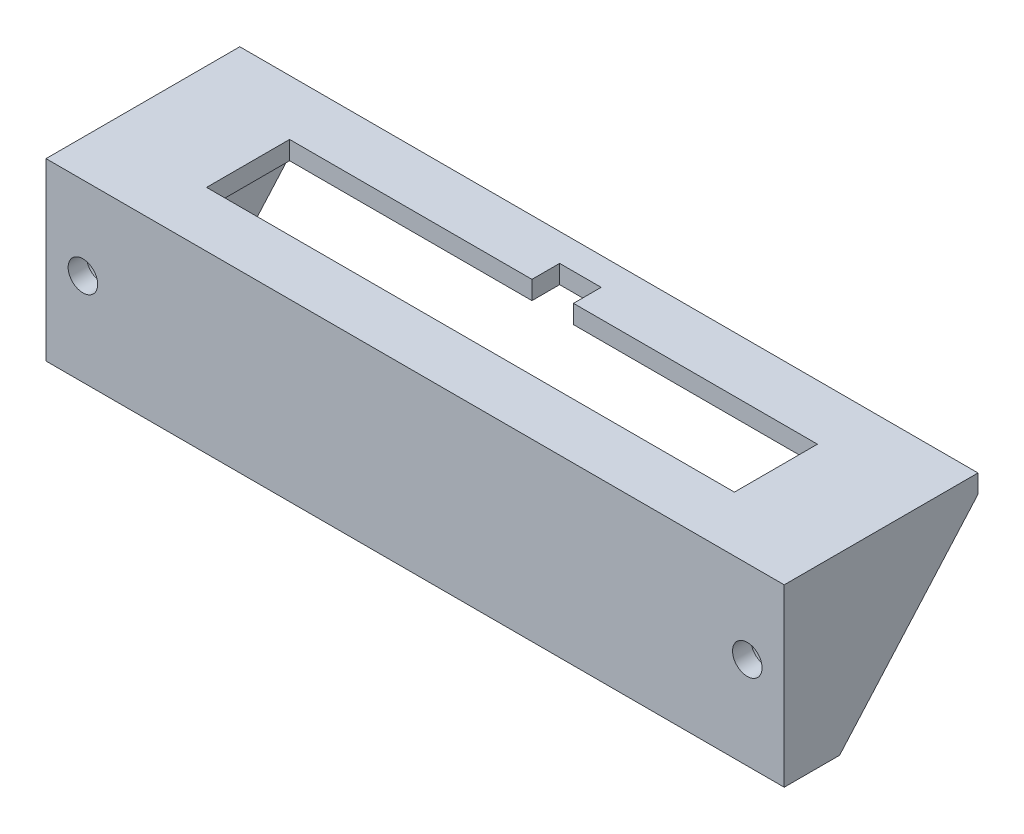
ISO-10303-21;
HEADER;
FILE_DESCRIPTION(('STEP AP214'),'2;1');
FILE_NAME('part.step','',(''),(''),'','','');
FILE_SCHEMA(('AUTOMOTIVE_DESIGN { 1 0 10303 214 1 1 1 1 }'));
ENDSEC;
DATA;
#1=APPLICATION_CONTEXT('core data for automotive mechanical design processes');
#2=APPLICATION_PROTOCOL_DEFINITION('international standard','automotive_design',2000,#1);
#3=PRODUCT_CONTEXT('',#1,'mechanical');
#4=PRODUCT('Part','Part','',(#3));
#5=PRODUCT_RELATED_PRODUCT_CATEGORY('part','',(#4));
#6=PRODUCT_DEFINITION_FORMATION('','',#4);
#7=PRODUCT_DEFINITION_CONTEXT('part definition',#1,'design');
#8=PRODUCT_DEFINITION('design','',#6,#7);
#9=PRODUCT_DEFINITION_SHAPE('','',#8);
#10=(LENGTH_UNIT() NAMED_UNIT(*) SI_UNIT(.MILLI.,.METRE.));
#11=(NAMED_UNIT(*) PLANE_ANGLE_UNIT() SI_UNIT($,.RADIAN.));
#12=(NAMED_UNIT(*) SI_UNIT($,.STERADIAN.) SOLID_ANGLE_UNIT());
#13=UNCERTAINTY_MEASURE_WITH_UNIT(LENGTH_MEASURE(1.E-05),#10,'distance_accuracy_value','');
#14=(GEOMETRIC_REPRESENTATION_CONTEXT(3) GLOBAL_UNCERTAINTY_ASSIGNED_CONTEXT((#13)) GLOBAL_UNIT_ASSIGNED_CONTEXT((#10,
#11,#12)) REPRESENTATION_CONTEXT('',''));
#15=CARTESIAN_POINT('',(0.,0.,0.));
#16=DIRECTION('',(0.,0.,1.));
#17=DIRECTION('',(1.,0.,0.));
#18=AXIS2_PLACEMENT_3D('',#15,#16,#17);
#19=CARTESIAN_POINT('',(0.,12.25,0.));
#20=DIRECTION('',(0.,1.,0.));
#21=DIRECTION('',(0.,0.,1.));
#22=AXIS2_PLACEMENT_3D('',#19,#20,#21);
#23=PLANE('',#22);
#24=DIRECTION('',(1.,0.,0.));
#25=VECTOR('',#24,1.);
#26=CARTESIAN_POINT('',(-26.4810638742548,12.25,28.0872942984967));
#27=LINE('',#26,#25);
#28=CARTESIAN_POINT('',(-26.4810638742548,12.25,28.0872942984967));
#29=VERTEX_POINT('',#28);
#30=CARTESIAN_POINT('',(-23.0810638742548,12.25,28.0872942984967));
#31=VERTEX_POINT('',#30);
#32=EDGE_CURVE('E187',#29,#31,#27,.T.);
#33=ORIENTED_EDGE('',*,*,#32,.F.);
#34=DIRECTION('',(0.,0.,1.));
#35=VECTOR('',#34,1.);
#36=CARTESIAN_POINT('',(-26.4810638742548,12.25,13.0872942984967));
#37=LINE('',#36,#35);
#38=CARTESIAN_POINT('',(-26.4810638742548,12.25,13.0872942984967));
#39=VERTEX_POINT('',#38);
#40=EDGE_CURVE('E234',#39,#29,#37,.T.);
#41=ORIENTED_EDGE('',*,*,#40,.F.);
#42=DIRECTION('',(-1.,0.,0.));
#43=VECTOR('',#42,1.);
#44=CARTESIAN_POINT('',(-34.4810638742549,12.25,13.0872942984967));
#45=LINE('',#44,#43);
#46=CARTESIAN_POINT('',(37.5189361257452,12.25,13.0872942984967));
#47=VERTEX_POINT('',#46);
#48=EDGE_CURVE('E85',#47,#39,#45,.T.);
#49=ORIENTED_EDGE('',*,*,#48,.F.);
#50=DIRECTION('',(0.,0.,1.));
#51=VECTOR('',#50,1.);
#52=CARTESIAN_POINT('',(37.5189361257452,12.25,13.0872942984967));
#53=LINE('',#52,#51);
#54=CARTESIAN_POINT('',(37.5189361257452,12.25,28.0872942984967));
#55=VERTEX_POINT('',#54);
#56=EDGE_CURVE('E191',#47,#55,#53,.T.);
#57=ORIENTED_EDGE('',*,*,#56,.T.);
#58=CARTESIAN_POINT('',(34.1189361257452,12.25,28.0872942984967));
#59=VERTEX_POINT('',#58);
#60=EDGE_CURVE('E175',#59,#55,#27,.T.);
#61=ORIENTED_EDGE('',*,*,#60,.F.);
#62=DIRECTION('',(0.,0.,-1.));
#63=VECTOR('',#62,1.);
#64=CARTESIAN_POINT('',(34.1189361257452,12.25,28.0872942984967));
#65=LINE('',#64,#63);
#66=CARTESIAN_POINT('',(34.1189361257452,12.25,19.0872942984967));
#67=VERTEX_POINT('',#66);
#68=EDGE_CURVE('E286',#59,#67,#65,.T.);
#69=ORIENTED_EDGE('',*,*,#68,.T.);
#70=DIRECTION('',(-1.,0.,0.));
#71=VECTOR('',#70,1.);
#72=CARTESIAN_POINT('',(7.68108705386775,12.25,19.0872942984967));
#73=LINE('',#72,#71);
#74=CARTESIAN_POINT('',(7.68108705386775,12.25,19.0872942984967));
#75=VERTEX_POINT('',#74);
#76=EDGE_CURVE('E289',#67,#75,#73,.T.);
#77=ORIENTED_EDGE('',*,*,#76,.T.);
#78=DIRECTION('',(0.,0.,-1.));
#79=VECTOR('',#78,1.);
#80=CARTESIAN_POINT('',(7.68108705386775,12.25,19.0872942984967));
#81=LINE('',#80,#79);
#82=CARTESIAN_POINT('',(7.68108705386775,12.25,16.0872942984967));
#83=VERTEX_POINT('',#82);
#84=EDGE_CURVE('E293',#75,#83,#81,.T.);
#85=ORIENTED_EDGE('',*,*,#84,.T.);
#86=DIRECTION('',(-1.,0.,0.));
#87=VECTOR('',#86,1.);
#88=CARTESIAN_POINT('',(3.18108705386775,12.25,16.0872942984967));
#89=LINE('',#88,#87);
#90=CARTESIAN_POINT('',(3.18108705386775,12.25,16.0872942984967));
#91=VERTEX_POINT('',#90);
#92=EDGE_CURVE('E297',#83,#91,#89,.T.);
#93=ORIENTED_EDGE('',*,*,#92,.T.);
#94=DIRECTION('',(0.,0.,1.));
#95=VECTOR('',#94,1.);
#96=CARTESIAN_POINT('',(3.18108705386775,12.25,19.0872942984967));
#97=LINE('',#96,#95);
#98=CARTESIAN_POINT('',(3.18108705386775,12.25,19.0872942984967));
#99=VERTEX_POINT('',#98);
#100=EDGE_CURVE('E301',#91,#99,#97,.T.);
#101=ORIENTED_EDGE('',*,*,#100,.T.);
#102=DIRECTION('',(-1.,0.,0.));
#103=VECTOR('',#102,1.);
#104=CARTESIAN_POINT('',(-23.0810638742548,12.25,19.0872942984967));
#105=LINE('',#104,#103);
#106=CARTESIAN_POINT('',(-23.0810638742548,12.25,19.0872942984967));
#107=VERTEX_POINT('',#106);
#108=EDGE_CURVE('E260',#99,#107,#105,.T.);
#109=ORIENTED_EDGE('',*,*,#108,.T.);
#110=DIRECTION('',(0.,0.,1.));
#111=VECTOR('',#110,1.);
#112=CARTESIAN_POINT('',(-23.0810638742548,12.25,28.0872942984967));
#113=LINE('',#112,#111);
#114=EDGE_CURVE('E255',#107,#31,#113,.T.);
#115=ORIENTED_EDGE('',*,*,#114,.T.);
#116=EDGE_LOOP('',(#33,#41,#49,#57,#61,#69,#77,#85,#93,#101,#109,#115));
#117=FACE_BOUND('',#116,.T.);
#118=ADVANCED_FACE('F59',(#117),#23,.F.);
#119=CARTESIAN_POINT('',(-26.4810638742548,0.,0.));
#120=DIRECTION('',(1.,0.,0.));
#121=DIRECTION('',(0.,0.,-1.));
#122=AXIS2_PLACEMENT_3D('',#119,#120,#121);
#123=PLANE('',#122);
#124=ORIENTED_EDGE('',*,*,#40,.T.);
#125=DIRECTION('',(0.,1.,0.));
#126=VECTOR('',#125,1.);
#127=CARTESIAN_POINT('',(-26.4810638742548,-69.0306347199528,28.0872942984967));
#128=LINE('',#127,#126);
#129=CARTESIAN_POINT('',(-26.4810638742548,-4.75000000000001,28.0872942984967));
#130=VERTEX_POINT('',#129);
#131=EDGE_CURVE('E194',#130,#29,#128,.T.);
#132=ORIENTED_EDGE('',*,*,#131,.F.);
#133=DIRECTION('',(0.,0.749837855365093,-0.661621637086846));
#134=VECTOR('',#133,1.);
#135=CARTESIAN_POINT('',(-26.4810638742548,-4.75,28.0872942984967));
#136=LINE('',#135,#134);
#137=EDGE_CURVE('E230',#130,#39,#136,.T.);
#138=ORIENTED_EDGE('',*,*,#137,.T.);
#139=EDGE_LOOP('',(#124,#132,#138));
#140=FACE_BOUND('',#139,.T.);
#141=ADVANCED_FACE('F384',(#140),#123,.T.);
#142=CARTESIAN_POINT('',(37.5189361257452,0.,0.));
#143=DIRECTION('',(-1.,0.,0.));
#144=DIRECTION('',(0.,0.,-1.));
#145=AXIS2_PLACEMENT_3D('',#142,#143,#144);
#146=PLANE('',#145);
#147=DIRECTION('',(0.,0.749837855365093,-0.661621637086846));
#148=VECTOR('',#147,1.);
#149=CARTESIAN_POINT('',(37.5189361257452,-4.75,28.0872942984967));
#150=LINE('',#149,#148);
#151=CARTESIAN_POINT('',(37.5189361257452,-4.75,28.0872942984967));
#152=VERTEX_POINT('',#151);
#153=EDGE_CURVE('E77',#152,#47,#150,.T.);
#154=ORIENTED_EDGE('',*,*,#153,.F.);
#155=DIRECTION('',(0.,1.,0.));
#156=VECTOR('',#155,1.);
#157=CARTESIAN_POINT('',(37.5189361257452,-69.0306347199528,28.0872942984967));
#158=LINE('',#157,#156);
#159=EDGE_CURVE('E178',#152,#55,#158,.T.);
#160=ORIENTED_EDGE('',*,*,#159,.T.);
#161=ORIENTED_EDGE('',*,*,#56,.F.);
#162=EDGE_LOOP('',(#154,#160,#161));
#163=FACE_BOUND('',#162,.T.);
#164=ADVANCED_FACE('F190',(#163),#146,.T.);
#165=CARTESIAN_POINT('',(41.5189361257452,5.25,13.0872942984967));
#166=DIRECTION('',(0.,0.,-1.));
#167=DIRECTION('',(-1.,0.,0.));
#168=AXIS2_PLACEMENT_3D('',#165,#166,#167);
#169=CYLINDRICAL_SURFACE('',#168,1.6);
#170=CARTESIAN_POINT('',(41.5189361257452,5.25,34.0872942984967));
#171=DIRECTION('',(0.,0.,-1.));
#172=DIRECTION('',(-1.,0.,0.));
#173=AXIS2_PLACEMENT_3D('',#170,#171,#172);
#174=CIRCLE('',#173,1.6);
#175=CARTESIAN_POINT('',(39.9189361257452,5.25,34.0872942984967));
#176=VERTEX_POINT('',#175);
#177=EDGE_CURVE('E208',#176,#176,#174,.T.);
#178=CARTESIAN_POINT('',(41.5189361257452,5.25,32.0872942984967));
#179=DIRECTION('',(0.,0.,-1.));
#180=DIRECTION('',(-1.,0.,0.));
#181=AXIS2_PLACEMENT_3D('',#178,#179,#180);
#182=CIRCLE('',#181,1.6);
#183=CARTESIAN_POINT('',(39.9189361257452,5.25,32.0872942984967));
#184=VERTEX_POINT('',#183);
#185=EDGE_CURVE('E451',#184,#184,#182,.F.);
#186=CARTESIAN_POINT('',(39.9189361257452,5.25,34.0872942984967));
#187=CARTESIAN_POINT('',(39.9189361257452,5.25,34.0664609651634));
#188=CARTESIAN_POINT('',(39.9189361257452,5.25,34.04562763183));
#189=CARTESIAN_POINT('',(39.9189361257452,5.25,34.0039609651634));
#190=CARTESIAN_POINT('',(39.9189361257452,5.25,33.98312763183));
#191=CARTESIAN_POINT('',(39.9189361257452,5.25,33.9414609651634));
#192=CARTESIAN_POINT('',(39.9189361257452,5.25,33.92062763183));
#193=CARTESIAN_POINT('',(39.9189361257452,5.25,33.8789609651634));
#194=CARTESIAN_POINT('',(39.9189361257452,5.25,33.85812763183));
#195=CARTESIAN_POINT('',(39.9189361257452,5.25,33.8164609651634));
#196=CARTESIAN_POINT('',(39.9189361257452,5.25,33.79562763183));
#197=CARTESIAN_POINT('',(39.9189361257452,5.25,33.7539609651634));
#198=CARTESIAN_POINT('',(39.9189361257452,5.25,33.73312763183));
#199=CARTESIAN_POINT('',(39.9189361257452,5.25,33.6914609651634));
#200=CARTESIAN_POINT('',(39.9189361257452,5.25,33.67062763183));
#201=CARTESIAN_POINT('',(39.9189361257452,5.25,33.6289609651634));
#202=CARTESIAN_POINT('',(39.9189361257452,5.25,33.60812763183));
#203=CARTESIAN_POINT('',(39.9189361257452,5.25,33.5664609651634));
#204=CARTESIAN_POINT('',(39.9189361257452,5.25,33.54562763183));
#205=CARTESIAN_POINT('',(39.9189361257452,5.25,33.5039609651634));
#206=CARTESIAN_POINT('',(39.9189361257452,5.25,33.48312763183));
#207=CARTESIAN_POINT('',(39.9189361257452,5.25,33.4414609651634));
#208=CARTESIAN_POINT('',(39.9189361257452,5.25,33.42062763183));
#209=CARTESIAN_POINT('',(39.9189361257452,5.25,33.3789609651634));
#210=CARTESIAN_POINT('',(39.9189361257452,5.25,33.35812763183));
#211=CARTESIAN_POINT('',(39.9189361257452,5.25,33.3164609651634));
#212=CARTESIAN_POINT('',(39.9189361257452,5.25,33.29562763183));
#213=CARTESIAN_POINT('',(39.9189361257452,5.25,33.2539609651634));
#214=CARTESIAN_POINT('',(39.9189361257452,5.25,33.23312763183));
#215=CARTESIAN_POINT('',(39.9189361257452,5.25,33.1914609651634));
#216=CARTESIAN_POINT('',(39.9189361257452,5.25,33.17062763183));
#217=CARTESIAN_POINT('',(39.9189361257452,5.25,33.1289609651634));
#218=CARTESIAN_POINT('',(39.9189361257452,5.25,33.10812763183));
#219=CARTESIAN_POINT('',(39.9189361257452,5.25,33.0664609651634));
#220=CARTESIAN_POINT('',(39.9189361257452,5.25,33.04562763183));
#221=CARTESIAN_POINT('',(39.9189361257452,5.25,33.0039609651634));
#222=CARTESIAN_POINT('',(39.9189361257452,5.25,32.98312763183));
#223=CARTESIAN_POINT('',(39.9189361257452,5.25,32.9414609651634));
#224=CARTESIAN_POINT('',(39.9189361257452,5.25,32.92062763183));
#225=CARTESIAN_POINT('',(39.9189361257452,5.25,32.8789609651634));
#226=CARTESIAN_POINT('',(39.9189361257452,5.25,32.85812763183));
#227=CARTESIAN_POINT('',(39.9189361257452,5.25,32.8164609651634));
#228=CARTESIAN_POINT('',(39.9189361257452,5.25,32.79562763183));
#229=CARTESIAN_POINT('',(39.9189361257452,5.25,32.7539609651634));
#230=CARTESIAN_POINT('',(39.9189361257452,5.25,32.73312763183));
#231=CARTESIAN_POINT('',(39.9189361257452,5.25,32.6914609651634));
#232=CARTESIAN_POINT('',(39.9189361257452,5.25,32.67062763183));
#233=CARTESIAN_POINT('',(39.9189361257452,5.25,32.6289609651634));
#234=CARTESIAN_POINT('',(39.9189361257452,5.25,32.60812763183));
#235=CARTESIAN_POINT('',(39.9189361257452,5.25,32.5664609651634));
#236=CARTESIAN_POINT('',(39.9189361257452,5.25,32.54562763183));
#237=CARTESIAN_POINT('',(39.9189361257452,5.25,32.5039609651634));
#238=CARTESIAN_POINT('',(39.9189361257452,5.25,32.48312763183));
#239=CARTESIAN_POINT('',(39.9189361257452,5.25,32.4414609651634));
#240=CARTESIAN_POINT('',(39.9189361257452,5.25,32.42062763183));
#241=CARTESIAN_POINT('',(39.9189361257452,5.25,32.3789609651634));
#242=CARTESIAN_POINT('',(39.9189361257452,5.25,32.35812763183));
#243=CARTESIAN_POINT('',(39.9189361257452,5.25,32.3164609651634));
#244=CARTESIAN_POINT('',(39.9189361257452,5.25,32.29562763183));
#245=CARTESIAN_POINT('',(39.9189361257452,5.25,32.2539609651634));
#246=CARTESIAN_POINT('',(39.9189361257452,5.25,32.23312763183));
#247=CARTESIAN_POINT('',(39.9189361257452,5.25,32.1914609651634));
#248=CARTESIAN_POINT('',(39.9189361257452,5.25,32.17062763183));
#249=CARTESIAN_POINT('',(39.9189361257452,5.25,32.1289609651634));
#250=CARTESIAN_POINT('',(39.9189361257452,5.25,32.10812763183));
#251=CARTESIAN_POINT('',(39.9189361257452,5.25,32.0872942984967));
#252=B_SPLINE_CURVE_WITH_KNOTS('',3,(#186,#187,#188,#189,#190,#191,#192,#193,#194,#195,#196,
#197,#198,#199,#200,#201,#202,#203,#204,#205,#206,#207,#208,#209,#210,#211,#212,#213,#214,#215,
#216,#217,#218,#219,#220,#221,#222,#223,#224,#225,#226,#227,#228,#229,#230,#231,#232,#233,#234,
#235,#236,#237,#238,#239,#240,#241,#242,#243,#244,#245,#246,#247,#248,#249,#250,#251),
.UNSPECIFIED.,.F.,.F.,(4,2,2,2,2,2,2,2,2,2,2,2,2,2,2,2,2,2,2,2,2,2,2,2,2,2,2,2,2,2,2,2,4),(0.,
0.0625000000000001,0.125,0.1875,0.25,0.3125,0.375,0.4375,0.5,0.5625,0.625000000000001,
0.687500000000001,0.750000000000001,0.812500000000001,0.875000000000001,0.937500000000001,1.,
1.0625,1.125,1.1875,1.25,1.3125,1.375,1.4375,1.5,1.5625,1.625,1.6875,1.75,1.8125,1.875,1.9375,
2.),.UNSPECIFIED.);
#253=EDGE_CURVE('BSEAM367',#176,#184,#252,.T.);
#254=ORIENTED_EDGE('',*,*,#177,.F.);
#255=ORIENTED_EDGE('',*,*,#185,.F.);
#256=ORIENTED_EDGE('',*,*,#253,.T.);
#257=ORIENTED_EDGE('',*,*,#253,.F.);
#258=EDGE_LOOP('',(#254,#256,#255,#257));
#259=FACE_BOUND('',#258,.T.);
#260=ADVANCED_FACE('F367',(#259),#169,.F.);
#261=CARTESIAN_POINT('',(-26.4810638742548,-4.75,28.0872942984967));
#262=DIRECTION('',(0.,0.661621637086846,0.749837855365093));
#263=DIRECTION('',(0.,-0.749837855365093,0.661621637086846));
#264=AXIS2_PLACEMENT_3D('',#261,#262,#263);
#265=PLANE('',#264);
#266=DIRECTION('',(0.,0.749837855365093,-0.661621637086846));
#267=VECTOR('',#266,1.);
#268=CARTESIAN_POINT('',(-34.4810638742549,-4.75,28.0872942984967));
#269=LINE('',#268,#267);
#270=CARTESIAN_POINT('',(-34.4810638742549,-4.75,28.0872942984967));
#271=VERTEX_POINT('',#270);
#272=CARTESIAN_POINT('',(-34.4810638742549,12.25,13.0872942984967));
#273=VERTEX_POINT('',#272);
#274=EDGE_CURVE('E235',#271,#273,#269,.T.);
#275=ORIENTED_EDGE('',*,*,#274,.T.);
#276=DIRECTION('',(-1.,0.,0.));
#277=VECTOR('',#276,1.);
#278=CARTESIAN_POINT('',(-26.4810638742548,12.25,13.0872942984967));
#279=LINE('',#278,#277);
#280=EDGE_CURVE('E239',#39,#273,#279,.T.);
#281=ORIENTED_EDGE('',*,*,#280,.F.);
#282=ORIENTED_EDGE('',*,*,#137,.F.);
#283=DIRECTION('',(-1.,0.,0.));
#284=VECTOR('',#283,1.);
#285=CARTESIAN_POINT('',(-26.4810638742548,-4.75,28.0872942984967));
#286=LINE('',#285,#284);
#287=EDGE_CURVE('E247',#130,#271,#286,.T.);
#288=ORIENTED_EDGE('',*,*,#287,.T.);
#289=EDGE_LOOP('',(#275,#281,#282,#288));
#290=FACE_BOUND('',#289,.T.);
#291=CARTESIAN_POINT('',(-30.4810638742548,5.25,19.263764886732));
#292=DIRECTION('',(0.,0.661621637086846,0.749837855365093));
#293=DIRECTION('',(0.,0.749837855365093,-0.661621637086846));
#294=AXIS2_PLACEMENT_3D('',#291,#292,#293);
#295=ELLIPSE('',#294,4.13422712366346,3.1);
#296=CARTESIAN_POINT('',(-30.4810638742548,8.35,16.5284707690849));
#297=VERTEX_POINT('',#296);
#298=EDGE_CURVE('E224',#297,#297,#295,.F.);
#299=ORIENTED_EDGE('',*,*,#298,.F.);
#300=EDGE_LOOP('',(#299));
#301=FACE_BOUND('',#300,.T.);
#302=ADVANCED_FACE('F364',(#290,#301),#265,.F.);
#303=CARTESIAN_POINT('',(-30.4810638742548,5.25,13.0872942984967));
#304=DIRECTION('',(0.,0.,-1.));
#305=DIRECTION('',(-1.,0.,0.));
#306=AXIS2_PLACEMENT_3D('',#303,#304,#305);
#307=CYLINDRICAL_SURFACE('',#306,1.6);
#308=CARTESIAN_POINT('',(-30.4810638742548,5.25,34.0872942984967));
#309=DIRECTION('',(0.,0.,1.));
#310=DIRECTION('',(1.,0.,0.));
#311=AXIS2_PLACEMENT_3D('',#308,#309,#310);
#312=CIRCLE('',#311,1.6);
#313=CARTESIAN_POINT('',(-32.0810638742549,5.25,34.0872942984967));
#314=VERTEX_POINT('',#313);
#315=EDGE_CURVE('E225',#314,#314,#312,.T.);
#316=CARTESIAN_POINT('',(-30.4810638742548,5.25,32.0872942984967));
#317=DIRECTION('',(0.,0.,-1.));
#318=DIRECTION('',(-1.,0.,0.));
#319=AXIS2_PLACEMENT_3D('',#316,#317,#318);
#320=CIRCLE('',#319,1.6);
#321=CARTESIAN_POINT('',(-32.0810638742549,5.25,32.0872942984967));
#322=VERTEX_POINT('',#321);
#323=EDGE_CURVE('E220',#322,#322,#320,.T.);
#324=CARTESIAN_POINT('',(-32.0810638742549,5.25,34.0872942984967));
#325=CARTESIAN_POINT('',(-32.0810638742549,5.25,34.0664609651634));
#326=CARTESIAN_POINT('',(-32.0810638742549,5.25,34.04562763183));
#327=CARTESIAN_POINT('',(-32.0810638742549,5.25,34.0039609651634));
#328=CARTESIAN_POINT('',(-32.0810638742549,5.25,33.98312763183));
#329=CARTESIAN_POINT('',(-32.0810638742549,5.25,33.9414609651634));
#330=CARTESIAN_POINT('',(-32.0810638742549,5.25,33.92062763183));
#331=CARTESIAN_POINT('',(-32.0810638742549,5.25,33.8789609651634));
#332=CARTESIAN_POINT('',(-32.0810638742549,5.25,33.85812763183));
#333=CARTESIAN_POINT('',(-32.0810638742549,5.25,33.8164609651634));
#334=CARTESIAN_POINT('',(-32.0810638742549,5.25,33.79562763183));
#335=CARTESIAN_POINT('',(-32.0810638742549,5.25,33.7539609651634));
#336=CARTESIAN_POINT('',(-32.0810638742549,5.25,33.73312763183));
#337=CARTESIAN_POINT('',(-32.0810638742549,5.25,33.6914609651634));
#338=CARTESIAN_POINT('',(-32.0810638742549,5.25,33.67062763183));
#339=CARTESIAN_POINT('',(-32.0810638742549,5.25,33.6289609651634));
#340=CARTESIAN_POINT('',(-32.0810638742549,5.25,33.60812763183));
#341=CARTESIAN_POINT('',(-32.0810638742549,5.25,33.5664609651634));
#342=CARTESIAN_POINT('',(-32.0810638742549,5.25,33.54562763183));
#343=CARTESIAN_POINT('',(-32.0810638742549,5.25,33.5039609651634));
#344=CARTESIAN_POINT('',(-32.0810638742549,5.25,33.48312763183));
#345=CARTESIAN_POINT('',(-32.0810638742549,5.25,33.4414609651634));
#346=CARTESIAN_POINT('',(-32.0810638742549,5.25,33.42062763183));
#347=CARTESIAN_POINT('',(-32.0810638742549,5.25,33.3789609651634));
#348=CARTESIAN_POINT('',(-32.0810638742549,5.25,33.35812763183));
#349=CARTESIAN_POINT('',(-32.0810638742549,5.25,33.3164609651634));
#350=CARTESIAN_POINT('',(-32.0810638742549,5.25,33.29562763183));
#351=CARTESIAN_POINT('',(-32.0810638742549,5.25,33.2539609651634));
#352=CARTESIAN_POINT('',(-32.0810638742549,5.25,33.23312763183));
#353=CARTESIAN_POINT('',(-32.0810638742549,5.25,33.1914609651634));
#354=CARTESIAN_POINT('',(-32.0810638742549,5.25,33.17062763183));
#355=CARTESIAN_POINT('',(-32.0810638742549,5.25,33.1289609651634));
#356=CARTESIAN_POINT('',(-32.0810638742549,5.25,33.10812763183));
#357=CARTESIAN_POINT('',(-32.0810638742549,5.25,33.0664609651634));
#358=CARTESIAN_POINT('',(-32.0810638742549,5.25,33.04562763183));
#359=CARTESIAN_POINT('',(-32.0810638742549,5.25,33.0039609651634));
#360=CARTESIAN_POINT('',(-32.0810638742549,5.25,32.98312763183));
#361=CARTESIAN_POINT('',(-32.0810638742549,5.25,32.9414609651634));
#362=CARTESIAN_POINT('',(-32.0810638742549,5.25,32.92062763183));
#363=CARTESIAN_POINT('',(-32.0810638742549,5.25,32.8789609651634));
#364=CARTESIAN_POINT('',(-32.0810638742549,5.25,32.85812763183));
#365=CARTESIAN_POINT('',(-32.0810638742549,5.25,32.8164609651634));
#366=CARTESIAN_POINT('',(-32.0810638742549,5.25,32.79562763183));
#367=CARTESIAN_POINT('',(-32.0810638742549,5.25,32.7539609651634));
#368=CARTESIAN_POINT('',(-32.0810638742549,5.25,32.73312763183));
#369=CARTESIAN_POINT('',(-32.0810638742549,5.25,32.6914609651634));
#370=CARTESIAN_POINT('',(-32.0810638742549,5.25,32.67062763183));
#371=CARTESIAN_POINT('',(-32.0810638742549,5.25,32.6289609651634));
#372=CARTESIAN_POINT('',(-32.0810638742549,5.25,32.60812763183));
#373=CARTESIAN_POINT('',(-32.0810638742549,5.25,32.5664609651634));
#374=CARTESIAN_POINT('',(-32.0810638742549,5.25,32.54562763183));
#375=CARTESIAN_POINT('',(-32.0810638742549,5.25,32.5039609651634));
#376=CARTESIAN_POINT('',(-32.0810638742549,5.25,32.48312763183));
#377=CARTESIAN_POINT('',(-32.0810638742549,5.25,32.4414609651634));
#378=CARTESIAN_POINT('',(-32.0810638742549,5.25,32.42062763183));
#379=CARTESIAN_POINT('',(-32.0810638742549,5.25,32.3789609651634));
#380=CARTESIAN_POINT('',(-32.0810638742549,5.25,32.35812763183));
#381=CARTESIAN_POINT('',(-32.0810638742549,5.25,32.3164609651634));
#382=CARTESIAN_POINT('',(-32.0810638742549,5.25,32.29562763183));
#383=CARTESIAN_POINT('',(-32.0810638742549,5.25,32.2539609651634));
#384=CARTESIAN_POINT('',(-32.0810638742549,5.25,32.23312763183));
#385=CARTESIAN_POINT('',(-32.0810638742549,5.25,32.1914609651634));
#386=CARTESIAN_POINT('',(-32.0810638742549,5.25,32.17062763183));
#387=CARTESIAN_POINT('',(-32.0810638742549,5.25,32.1289609651634));
#388=CARTESIAN_POINT('',(-32.0810638742549,5.25,32.10812763183));
#389=CARTESIAN_POINT('',(-32.0810638742549,5.25,32.0872942984967));
#390=B_SPLINE_CURVE_WITH_KNOTS('',3,(#324,#325,#326,#327,#328,#329,#330,#331,#332,#333,#334,
#335,#336,#337,#338,#339,#340,#341,#342,#343,#344,#345,#346,#347,#348,#349,#350,#351,#352,#353,
#354,#355,#356,#357,#358,#359,#360,#361,#362,#363,#364,#365,#366,#367,#368,#369,#370,#371,#372,
#373,#374,#375,#376,#377,#378,#379,#380,#381,#382,#383,#384,#385,#386,#387,#388,#389),
.UNSPECIFIED.,.F.,.F.,(4,2,2,2,2,2,2,2,2,2,2,2,2,2,2,2,2,2,2,2,2,2,2,2,2,2,2,2,2,2,2,2,4),(0.,
0.0625000000000001,0.125,0.1875,0.25,0.3125,0.375,0.4375,0.5,0.5625,0.625000000000001,
0.687500000000001,0.750000000000001,0.812500000000001,0.875000000000001,0.937500000000001,1.,
1.0625,1.125,1.1875,1.25,1.3125,1.375,1.4375,1.49999999999999,1.56249999999999,1.62499999999999,
1.68749999999999,1.74999999999999,1.81249999999999,1.87499999999999,1.93749999999999,
1.99999999999999),.UNSPECIFIED.);
#391=EDGE_CURVE('BSEAM366',#314,#322,#390,.T.);
#392=ORIENTED_EDGE('',*,*,#315,.T.);
#393=ORIENTED_EDGE('',*,*,#323,.T.);
#394=ORIENTED_EDGE('',*,*,#391,.T.);
#395=ORIENTED_EDGE('',*,*,#391,.F.);
#396=EDGE_LOOP('',(#392,#394,#393,#395));
#397=FACE_BOUND('',#396,.T.);
#398=ADVANCED_FACE('F366',(#397),#307,.F.);
#399=CARTESIAN_POINT('',(0.,14.25,0.));
#400=DIRECTION('',(0.,1.,0.));
#401=DIRECTION('',(0.,0.,1.));
#402=AXIS2_PLACEMENT_3D('',#399,#400,#401);
#403=PLANE('',#402);
#404=DIRECTION('',(0.,0.,1.));
#405=VECTOR('',#404,1.);
#406=CARTESIAN_POINT('',(-34.4810638742549,14.25,13.0872942984967));
#407=LINE('',#406,#405);
#408=CARTESIAN_POINT('',(-34.4810638742549,14.25,13.0872942984967));
#409=VERTEX_POINT('',#408);
#410=CARTESIAN_POINT('',(-34.4810638742549,14.25,34.0872942984967));
#411=VERTEX_POINT('',#410);
#412=EDGE_CURVE('E332',#409,#411,#407,.T.);
#413=ORIENTED_EDGE('',*,*,#412,.T.);
#414=DIRECTION('',(1.,0.,0.));
#415=VECTOR('',#414,1.);
#416=CARTESIAN_POINT('',(-34.4810638742549,14.25,34.0872942984967));
#417=LINE('',#416,#415);
#418=CARTESIAN_POINT('',(45.5189361257452,14.25,34.0872942984967));
#419=VERTEX_POINT('',#418);
#420=EDGE_CURVE('E336',#411,#419,#417,.T.);
#421=ORIENTED_EDGE('',*,*,#420,.T.);
#422=DIRECTION('',(0.,0.,-1.));
#423=VECTOR('',#422,1.);
#424=CARTESIAN_POINT('',(45.5189361257452,14.25,13.0872942984967));
#425=LINE('',#424,#423);
#426=CARTESIAN_POINT('',(45.5189361257452,14.25,13.0872942984967));
#427=VERTEX_POINT('',#426);
#428=EDGE_CURVE('E340',#419,#427,#425,.T.);
#429=ORIENTED_EDGE('',*,*,#428,.T.);
#430=DIRECTION('',(-1.,0.,0.));
#431=VECTOR('',#430,1.);
#432=CARTESIAN_POINT('',(-34.4810638742549,14.25,13.0872942984967));
#433=LINE('',#432,#431);
#434=EDGE_CURVE('E343',#427,#409,#433,.T.);
#435=ORIENTED_EDGE('',*,*,#434,.T.);
#436=EDGE_LOOP('',(#413,#421,#429,#435));
#437=FACE_BOUND('',#436,.T.);
#438=DIRECTION('',(1.,0.,0.));
#439=VECTOR('',#438,1.);
#440=CARTESIAN_POINT('',(-23.0810638742548,14.25,28.0872942984967));
#441=LINE('',#440,#439);
#442=CARTESIAN_POINT('',(-23.0810638742548,14.25,28.0872942984967));
#443=VERTEX_POINT('',#442);
#444=CARTESIAN_POINT('',(34.1189361257452,14.25,28.0872942984967));
#445=VERTEX_POINT('',#444);
#446=EDGE_CURVE('E259',#443,#445,#441,.T.);
#447=ORIENTED_EDGE('',*,*,#446,.F.);
#448=DIRECTION('',(0.,0.,1.));
#449=VECTOR('',#448,1.);
#450=CARTESIAN_POINT('',(-23.0810638742548,14.25,28.0872942984967));
#451=LINE('',#450,#449);
#452=CARTESIAN_POINT('',(-23.0810638742548,14.25,19.0872942984967));
#453=VERTEX_POINT('',#452);
#454=EDGE_CURVE('E256',#453,#443,#451,.T.);
#455=ORIENTED_EDGE('',*,*,#454,.F.);
#456=DIRECTION('',(-1.,0.,0.));
#457=VECTOR('',#456,1.);
#458=CARTESIAN_POINT('',(-23.0810638742548,14.25,19.0872942984967));
#459=LINE('',#458,#457);
#460=CARTESIAN_POINT('',(3.18108705386775,14.25,19.0872942984967));
#461=VERTEX_POINT('',#460);
#462=EDGE_CURVE('E279',#461,#453,#459,.T.);
#463=ORIENTED_EDGE('',*,*,#462,.F.);
#464=DIRECTION('',(0.,0.,1.));
#465=VECTOR('',#464,1.);
#466=CARTESIAN_POINT('',(3.18108705386775,14.25,19.0872942984967));
#467=LINE('',#466,#465);
#468=CARTESIAN_POINT('',(3.18108705386775,14.25,16.0872942984967));
#469=VERTEX_POINT('',#468);
#470=EDGE_CURVE('E275',#469,#461,#467,.T.);
#471=ORIENTED_EDGE('',*,*,#470,.F.);
#472=DIRECTION('',(-1.,0.,0.));
#473=VECTOR('',#472,1.);
#474=CARTESIAN_POINT('',(3.18108705386775,14.25,16.0872942984967));
#475=LINE('',#474,#473);
#476=CARTESIAN_POINT('',(7.68108705386775,14.25,16.0872942984967));
#477=VERTEX_POINT('',#476);
#478=EDGE_CURVE('E272',#477,#469,#475,.T.);
#479=ORIENTED_EDGE('',*,*,#478,.F.);
#480=DIRECTION('',(0.,0.,-1.));
#481=VECTOR('',#480,1.);
#482=CARTESIAN_POINT('',(7.68108705386775,14.25,19.0872942984967));
#483=LINE('',#482,#481);
#484=CARTESIAN_POINT('',(7.68108705386775,14.25,19.0872942984967));
#485=VERTEX_POINT('',#484);
#486=EDGE_CURVE('E269',#485,#477,#483,.T.);
#487=ORIENTED_EDGE('',*,*,#486,.F.);
#488=DIRECTION('',(-1.,0.,0.));
#489=VECTOR('',#488,1.);
#490=CARTESIAN_POINT('',(7.68108705386775,14.25,19.0872942984967));
#491=LINE('',#490,#489);
#492=CARTESIAN_POINT('',(34.1189361257452,14.25,19.0872942984967));
#493=VERTEX_POINT('',#492);
#494=EDGE_CURVE('E266',#493,#485,#491,.T.);
#495=ORIENTED_EDGE('',*,*,#494,.F.);
#496=DIRECTION('',(0.,0.,-1.));
#497=VECTOR('',#496,1.);
#498=CARTESIAN_POINT('',(34.1189361257452,14.25,28.0872942984967));
#499=LINE('',#498,#497);
#500=EDGE_CURVE('E263',#445,#493,#499,.T.);
#501=ORIENTED_EDGE('',*,*,#500,.F.);
#502=EDGE_LOOP('',(#447,#455,#463,#471,#479,#487,#495,#501));
#503=FACE_BOUND('',#502,.T.);
#504=ADVANCED_FACE('F375',(#437,#503),#403,.T.);
#505=CARTESIAN_POINT('',(-34.4810638742549,14.25,13.0872942984967));
#506=DIRECTION('',(1.,0.,0.));
#507=DIRECTION('',(0.,0.,-1.));
#508=AXIS2_PLACEMENT_3D('',#505,#506,#507);
#509=PLANE('',#508);
#510=DIRECTION('',(0.,-1.,0.));
#511=VECTOR('',#510,1.);
#512=CARTESIAN_POINT('',(-34.4810638742549,14.25,13.0872942984967));
#513=LINE('',#512,#511);
#514=EDGE_CURVE('E346',#409,#273,#513,.T.);
#515=ORIENTED_EDGE('',*,*,#514,.T.);
#516=ORIENTED_EDGE('',*,*,#274,.F.);
#517=DIRECTION('',(0.,0.,-1.));
#518=VECTOR('',#517,1.);
#519=CARTESIAN_POINT('',(-34.4810638742549,-4.75,34.0872942984967));
#520=LINE('',#519,#518);
#521=CARTESIAN_POINT('',(-34.4810638742549,-4.75,34.0872942984967));
#522=VERTEX_POINT('',#521);
#523=EDGE_CURVE('E229',#522,#271,#520,.T.);
#524=ORIENTED_EDGE('',*,*,#523,.F.);
#525=DIRECTION('',(0.,-1.,0.));
#526=VECTOR('',#525,1.);
#527=CARTESIAN_POINT('',(-34.4810638742549,14.25,34.0872942984967));
#528=LINE('',#527,#526);
#529=EDGE_CURVE('E13',#411,#522,#528,.T.);
#530=ORIENTED_EDGE('',*,*,#529,.F.);
#531=ORIENTED_EDGE('',*,*,#412,.F.);
#532=EDGE_LOOP('',(#515,#516,#524,#530,#531));
#533=FACE_BOUND('',#532,.T.);
#534=ADVANCED_FACE('F61',(#533),#509,.F.);
#535=CARTESIAN_POINT('',(-34.4810638742549,14.25,34.0872942984967));
#536=DIRECTION('',(0.,0.,-1.));
#537=DIRECTION('',(-1.,0.,0.));
#538=AXIS2_PLACEMENT_3D('',#535,#536,#537);
#539=PLANE('',#538);
#540=DIRECTION('',(-1.,0.,0.));
#541=VECTOR('',#540,1.);
#542=CARTESIAN_POINT('',(-26.4810638742548,-4.75,34.0872942984967));
#543=LINE('',#542,#541);
#544=CARTESIAN_POINT('',(45.5189361257452,-4.75,34.0872942984967));
#545=VERTEX_POINT('',#544);
#546=EDGE_CURVE('E251',#545,#522,#543,.T.);
#547=ORIENTED_EDGE('',*,*,#546,.F.);
#548=DIRECTION('',(0.,-1.,0.));
#549=VECTOR('',#548,1.);
#550=CARTESIAN_POINT('',(45.5189361257452,14.25,34.0872942984967));
#551=LINE('',#550,#549);
#552=EDGE_CURVE('E69',#419,#545,#551,.T.);
#553=ORIENTED_EDGE('',*,*,#552,.F.);
#554=ORIENTED_EDGE('',*,*,#420,.F.);
#555=ORIENTED_EDGE('',*,*,#529,.T.);
#556=EDGE_LOOP('',(#547,#553,#554,#555));
#557=FACE_BOUND('',#556,.T.);
#558=ORIENTED_EDGE('',*,*,#177,.T.);
#559=EDGE_LOOP('',(#558));
#560=FACE_BOUND('',#559,.T.);
#561=ORIENTED_EDGE('',*,*,#315,.F.);
#562=EDGE_LOOP('',(#561));
#563=FACE_BOUND('',#562,.T.);
#564=ADVANCED_FACE('F400',(#557,#560,#563),#539,.F.);
#565=CARTESIAN_POINT('',(45.5189361257452,14.25,13.0872942984967));
#566=DIRECTION('',(-1.,0.,0.));
#567=DIRECTION('',(0.,0.,1.));
#568=AXIS2_PLACEMENT_3D('',#565,#566,#567);
#569=PLANE('',#568);
#570=ORIENTED_EDGE('',*,*,#552,.T.);
#571=DIRECTION('',(0.,0.,-1.));
#572=VECTOR('',#571,1.);
#573=CARTESIAN_POINT('',(45.5189361257452,-4.75,34.0872942984967));
#574=LINE('',#573,#572);
#575=CARTESIAN_POINT('',(45.5189361257452,-4.75,28.0872942984967));
#576=VERTEX_POINT('',#575);
#577=EDGE_CURVE('E198',#545,#576,#574,.T.);
#578=ORIENTED_EDGE('',*,*,#577,.T.);
#579=DIRECTION('',(0.,0.749837855365093,-0.661621637086846));
#580=VECTOR('',#579,1.);
#581=CARTESIAN_POINT('',(45.5189361257452,-4.75,28.0872942984967));
#582=LINE('',#581,#580);
#583=CARTESIAN_POINT('',(45.5189361257452,12.25,13.0872942984967));
#584=VERTEX_POINT('',#583);
#585=EDGE_CURVE('E205',#576,#584,#582,.T.);
#586=ORIENTED_EDGE('',*,*,#585,.T.);
#587=DIRECTION('',(0.,-1.,0.));
#588=VECTOR('',#587,1.);
#589=CARTESIAN_POINT('',(45.5189361257452,14.25,13.0872942984967));
#590=LINE('',#589,#588);
#591=EDGE_CURVE('E352',#427,#584,#590,.T.);
#592=ORIENTED_EDGE('',*,*,#591,.F.);
#593=ORIENTED_EDGE('',*,*,#428,.F.);
#594=EDGE_LOOP('',(#570,#578,#586,#592,#593));
#595=FACE_BOUND('',#594,.T.);
#596=ADVANCED_FACE('F398',(#595),#569,.F.);
#597=CARTESIAN_POINT('',(-34.4810638742549,14.25,13.0872942984967));
#598=DIRECTION('',(0.,0.,1.));
#599=DIRECTION('',(1.,0.,0.));
#600=AXIS2_PLACEMENT_3D('',#597,#598,#599);
#601=PLANE('',#600);
#602=EDGE_CURVE('E337',#584,#47,#45,.T.);
#603=ORIENTED_EDGE('',*,*,#602,.T.);
#604=ORIENTED_EDGE('',*,*,#48,.T.);
#605=ORIENTED_EDGE('',*,*,#280,.T.);
#606=ORIENTED_EDGE('',*,*,#514,.F.);
#607=ORIENTED_EDGE('',*,*,#434,.F.);
#608=ORIENTED_EDGE('',*,*,#591,.T.);
#609=EDGE_LOOP('',(#603,#604,#605,#606,#607,#608));
#610=FACE_BOUND('',#609,.T.);
#611=ADVANCED_FACE('F394',(#610),#601,.F.);
#612=CARTESIAN_POINT('',(-23.0810638742548,14.25,28.0872942984967));
#613=DIRECTION('',(1.,0.,0.));
#614=DIRECTION('',(0.,0.,-1.));
#615=AXIS2_PLACEMENT_3D('',#612,#613,#614);
#616=PLANE('',#615);
#617=ORIENTED_EDGE('',*,*,#114,.F.);
#618=DIRECTION('',(0.,-1.,0.));
#619=VECTOR('',#618,1.);
#620=CARTESIAN_POINT('',(-23.0810638742548,14.25,19.0872942984967));
#621=LINE('',#620,#619);
#622=EDGE_CURVE('E282',#453,#107,#621,.T.);
#623=ORIENTED_EDGE('',*,*,#622,.F.);
#624=ORIENTED_EDGE('',*,*,#454,.T.);
#625=DIRECTION('',(0.,-1.,0.));
#626=VECTOR('',#625,1.);
#627=CARTESIAN_POINT('',(-23.0810638742548,14.25,28.0872942984967));
#628=LINE('',#627,#626);
#629=EDGE_CURVE('E328',#443,#31,#628,.T.);
#630=ORIENTED_EDGE('',*,*,#629,.T.);
#631=EDGE_LOOP('',(#617,#623,#624,#630));
#632=FACE_BOUND('',#631,.T.);
#633=ADVANCED_FACE('F397',(#632),#616,.T.);
#634=CARTESIAN_POINT('',(-23.0810638742548,14.25,28.0872942984967));
#635=DIRECTION('',(0.,0.,-1.));
#636=DIRECTION('',(-1.,0.,0.));
#637=AXIS2_PLACEMENT_3D('',#634,#635,#636);
#638=PLANE('',#637);
#639=DIRECTION('',(0.,-1.,0.));
#640=VECTOR('',#639,1.);
#641=CARTESIAN_POINT('',(34.1189361257452,14.25,28.0872942984967));
#642=LINE('',#641,#640);
#643=EDGE_CURVE('E181',#445,#59,#642,.T.);
#644=ORIENTED_EDGE('',*,*,#643,.T.);
#645=ORIENTED_EDGE('',*,*,#60,.T.);
#646=ORIENTED_EDGE('',*,*,#159,.F.);
#647=DIRECTION('',(-1.,0.,0.));
#648=VECTOR('',#647,1.);
#649=CARTESIAN_POINT('',(-26.4810638742548,-4.75,28.0872942984967));
#650=LINE('',#649,#648);
#651=EDGE_CURVE('E193',#152,#130,#650,.T.);
#652=ORIENTED_EDGE('',*,*,#651,.T.);
#653=ORIENTED_EDGE('',*,*,#131,.T.);
#654=ORIENTED_EDGE('',*,*,#32,.T.);
#655=ORIENTED_EDGE('',*,*,#629,.F.);
#656=ORIENTED_EDGE('',*,*,#446,.T.);
#657=EDGE_LOOP('',(#644,#645,#646,#652,#653,#654,#655,#656));
#658=FACE_BOUND('',#657,.T.);
#659=ADVANCED_FACE('F177',(#658),#638,.T.);
#660=CARTESIAN_POINT('',(34.1189361257452,14.25,28.0872942984967));
#661=DIRECTION('',(-1.,0.,0.));
#662=DIRECTION('',(0.,0.,1.));
#663=AXIS2_PLACEMENT_3D('',#660,#661,#662);
#664=PLANE('',#663);
#665=ORIENTED_EDGE('',*,*,#68,.F.);
#666=ORIENTED_EDGE('',*,*,#643,.F.);
#667=ORIENTED_EDGE('',*,*,#500,.T.);
#668=DIRECTION('',(0.,-1.,0.));
#669=VECTOR('',#668,1.);
#670=CARTESIAN_POINT('',(34.1189361257452,14.25,19.0872942984967));
#671=LINE('',#670,#669);
#672=EDGE_CURVE('E323',#493,#67,#671,.T.);
#673=ORIENTED_EDGE('',*,*,#672,.T.);
#674=EDGE_LOOP('',(#665,#666,#667,#673));
#675=FACE_BOUND('',#674,.T.);
#676=ADVANCED_FACE('F487',(#675),#664,.T.);
#677=CARTESIAN_POINT('',(7.68108705386775,14.25,19.0872942984967));
#678=DIRECTION('',(0.,0.,1.));
#679=DIRECTION('',(1.,0.,0.));
#680=AXIS2_PLACEMENT_3D('',#677,#678,#679);
#681=PLANE('',#680);
#682=ORIENTED_EDGE('',*,*,#76,.F.);
#683=ORIENTED_EDGE('',*,*,#672,.F.);
#684=ORIENTED_EDGE('',*,*,#494,.T.);
#685=DIRECTION('',(0.,-1.,0.));
#686=VECTOR('',#685,1.);
#687=CARTESIAN_POINT('',(7.68108705386775,14.25,19.0872942984967));
#688=LINE('',#687,#686);
#689=EDGE_CURVE('E320',#485,#75,#688,.T.);
#690=ORIENTED_EDGE('',*,*,#689,.T.);
#691=EDGE_LOOP('',(#682,#683,#684,#690));
#692=FACE_BOUND('',#691,.T.);
#693=ADVANCED_FACE('F492',(#692),#681,.T.);
#694=CARTESIAN_POINT('',(7.68108705386775,14.25,19.0872942984967));
#695=DIRECTION('',(-1.,0.,0.));
#696=DIRECTION('',(0.,0.,1.));
#697=AXIS2_PLACEMENT_3D('',#694,#695,#696);
#698=PLANE('',#697);
#699=ORIENTED_EDGE('',*,*,#84,.F.);
#700=ORIENTED_EDGE('',*,*,#689,.F.);
#701=ORIENTED_EDGE('',*,*,#486,.T.);
#702=DIRECTION('',(0.,-1.,0.));
#703=VECTOR('',#702,1.);
#704=CARTESIAN_POINT('',(7.68108705386775,14.25,16.0872942984967));
#705=LINE('',#704,#703);
#706=EDGE_CURVE('E317',#477,#83,#705,.T.);
#707=ORIENTED_EDGE('',*,*,#706,.T.);
#708=EDGE_LOOP('',(#699,#700,#701,#707));
#709=FACE_BOUND('',#708,.T.);
#710=ADVANCED_FACE('F496',(#709),#698,.T.);
#711=CARTESIAN_POINT('',(3.18108705386775,14.25,16.0872942984967));
#712=DIRECTION('',(0.,0.,1.));
#713=DIRECTION('',(1.,0.,0.));
#714=AXIS2_PLACEMENT_3D('',#711,#712,#713);
#715=PLANE('',#714);
#716=ORIENTED_EDGE('',*,*,#92,.F.);
#717=ORIENTED_EDGE('',*,*,#706,.F.);
#718=ORIENTED_EDGE('',*,*,#478,.T.);
#719=DIRECTION('',(0.,-1.,0.));
#720=VECTOR('',#719,1.);
#721=CARTESIAN_POINT('',(3.18108705386775,14.25,16.0872942984967));
#722=LINE('',#721,#720);
#723=EDGE_CURVE('E314',#469,#91,#722,.T.);
#724=ORIENTED_EDGE('',*,*,#723,.T.);
#725=EDGE_LOOP('',(#716,#717,#718,#724));
#726=FACE_BOUND('',#725,.T.);
#727=ADVANCED_FACE('F501',(#726),#715,.T.);
#728=CARTESIAN_POINT('',(3.18108705386775,14.25,19.0872942984967));
#729=DIRECTION('',(1.,0.,0.));
#730=DIRECTION('',(0.,0.,-1.));
#731=AXIS2_PLACEMENT_3D('',#728,#729,#730);
#732=PLANE('',#731);
#733=ORIENTED_EDGE('',*,*,#100,.F.);
#734=ORIENTED_EDGE('',*,*,#723,.F.);
#735=ORIENTED_EDGE('',*,*,#470,.T.);
#736=DIRECTION('',(0.,-1.,0.));
#737=VECTOR('',#736,1.);
#738=CARTESIAN_POINT('',(3.18108705386775,14.25,19.0872942984967));
#739=LINE('',#738,#737);
#740=EDGE_CURVE('E311',#461,#99,#739,.T.);
#741=ORIENTED_EDGE('',*,*,#740,.T.);
#742=EDGE_LOOP('',(#733,#734,#735,#741));
#743=FACE_BOUND('',#742,.T.);
#744=ADVANCED_FACE('F506',(#743),#732,.T.);
#745=CARTESIAN_POINT('',(-23.0810638742548,14.25,19.0872942984967));
#746=DIRECTION('',(0.,0.,1.));
#747=DIRECTION('',(1.,0.,0.));
#748=AXIS2_PLACEMENT_3D('',#745,#746,#747);
#749=PLANE('',#748);
#750=ORIENTED_EDGE('',*,*,#108,.F.);
#751=ORIENTED_EDGE('',*,*,#740,.F.);
#752=ORIENTED_EDGE('',*,*,#462,.T.);
#753=ORIENTED_EDGE('',*,*,#622,.T.);
#754=EDGE_LOOP('',(#750,#751,#752,#753));
#755=FACE_BOUND('',#754,.T.);
#756=ADVANCED_FACE('F430',(#755),#749,.T.);
#757=CARTESIAN_POINT('',(-26.4810638742548,-4.75,34.0872942984967));
#758=DIRECTION('',(0.,1.,0.));
#759=DIRECTION('',(0.,0.,1.));
#760=AXIS2_PLACEMENT_3D('',#757,#758,#759);
#761=PLANE('',#760);
#762=ORIENTED_EDGE('',*,*,#523,.T.);
#763=ORIENTED_EDGE('',*,*,#287,.F.);
#764=ORIENTED_EDGE('',*,*,#651,.F.);
#765=DIRECTION('',(1.,0.,0.));
#766=VECTOR('',#765,1.);
#767=CARTESIAN_POINT('',(37.5189361257452,-4.75,28.0872942984967));
#768=LINE('',#767,#766);
#769=EDGE_CURVE('E202',#152,#576,#768,.T.);
#770=ORIENTED_EDGE('',*,*,#769,.T.);
#771=ORIENTED_EDGE('',*,*,#577,.F.);
#772=ORIENTED_EDGE('',*,*,#546,.T.);
#773=EDGE_LOOP('',(#762,#763,#764,#770,#771,#772));
#774=FACE_BOUND('',#773,.T.);
#775=ADVANCED_FACE('F425',(#774),#761,.F.);
#776=CARTESIAN_POINT('',(-30.4810638742548,5.25,42.8554183852099));
#777=DIRECTION('',(0.,0.,-1.));
#778=DIRECTION('',(-1.,0.,0.));
#779=AXIS2_PLACEMENT_3D('',#776,#777,#778);
#780=CYLINDRICAL_SURFACE('',#779,3.1);
#781=CARTESIAN_POINT('',(-30.4810638742548,5.25,32.0872942984967));
#782=DIRECTION('',(0.,0.,-1.));
#783=DIRECTION('',(-1.,0.,0.));
#784=AXIS2_PLACEMENT_3D('',#781,#782,#783);
#785=CIRCLE('',#784,3.1);
#786=CARTESIAN_POINT('',(-33.5810638742549,5.25,32.0872942984967));
#787=VERTEX_POINT('',#786);
#788=EDGE_CURVE('E216',#787,#787,#785,.T.);
#789=ORIENTED_EDGE('',*,*,#788,.F.);
#790=EDGE_LOOP('',(#789));
#791=FACE_BOUND('',#790,.T.);
#792=ORIENTED_EDGE('',*,*,#298,.T.);
#793=EDGE_LOOP('',(#792));
#794=FACE_BOUND('',#793,.T.);
#795=ADVANCED_FACE('F362',(#791,#794),#780,.F.);
#796=CARTESIAN_POINT('',(-34.4810638742549,14.25,32.0872942984967));
#797=DIRECTION('',(0.,0.,-1.));
#798=DIRECTION('',(-1.,0.,0.));
#799=AXIS2_PLACEMENT_3D('',#796,#797,#798);
#800=PLANE('',#799);
#801=ORIENTED_EDGE('',*,*,#323,.F.);
#802=EDGE_LOOP('',(#801));
#803=FACE_BOUND('',#802,.T.);
#804=ORIENTED_EDGE('',*,*,#788,.T.);
#805=EDGE_LOOP('',(#804));
#806=FACE_BOUND('',#805,.T.);
#807=ADVANCED_FACE('F417',(#803,#806),#800,.T.);
#808=CARTESIAN_POINT('',(37.5189361257452,-4.75,28.0872942984967));
#809=DIRECTION('',(0.,-0.661621637086846,-0.749837855365093));
#810=DIRECTION('',(0.,0.749837855365093,-0.661621637086846));
#811=AXIS2_PLACEMENT_3D('',#808,#809,#810);
#812=PLANE('',#811);
#813=CARTESIAN_POINT('',(41.5189361257452,5.25,19.263764886732));
#814=DIRECTION('',(0.,-0.661621637086846,-0.749837855365093));
#815=DIRECTION('',(0.,0.749837855365093,-0.661621637086846));
#816=AXIS2_PLACEMENT_3D('',#813,#814,#815);
#817=ELLIPSE('',#816,4.13422712366346,3.1);
#818=CARTESIAN_POINT('',(41.5189361257452,8.35,16.5284707690849));
#819=VERTEX_POINT('',#818);
#820=EDGE_CURVE('E63',#819,#819,#817,.T.);
#821=ORIENTED_EDGE('',*,*,#820,.F.);
#822=EDGE_LOOP('',(#821));
#823=FACE_BOUND('',#822,.T.);
#824=ORIENTED_EDGE('',*,*,#585,.F.);
#825=ORIENTED_EDGE('',*,*,#769,.F.);
#826=ORIENTED_EDGE('',*,*,#153,.T.);
#827=ORIENTED_EDGE('',*,*,#602,.F.);
#828=EDGE_LOOP('',(#824,#825,#826,#827));
#829=FACE_BOUND('',#828,.T.);
#830=ADVANCED_FACE('F420',(#823,#829),#812,.T.);
#831=CARTESIAN_POINT('',(41.5189361257452,5.25,42.8554183852099));
#832=DIRECTION('',(0.,0.,-1.));
#833=DIRECTION('',(-1.,0.,0.));
#834=AXIS2_PLACEMENT_3D('',#831,#832,#833);
#835=CYLINDRICAL_SURFACE('',#834,3.1);
#836=ORIENTED_EDGE('',*,*,#820,.T.);
#837=EDGE_LOOP('',(#836));
#838=FACE_BOUND('',#837,.T.);
#839=CARTESIAN_POINT('',(41.5189361257452,5.25,32.0872942984967));
#840=DIRECTION('',(0.,0.,-1.));
#841=DIRECTION('',(-1.,0.,0.));
#842=AXIS2_PLACEMENT_3D('',#839,#840,#841);
#843=CIRCLE('',#842,3.1);
#844=CARTESIAN_POINT('',(38.4189361257451,5.25,32.0872942984967));
#845=VERTEX_POINT('',#844);
#846=EDGE_CURVE('E448',#845,#845,#843,.F.);
#847=ORIENTED_EDGE('',*,*,#846,.T.);
#848=EDGE_LOOP('',(#847));
#849=FACE_BOUND('',#848,.T.);
#850=ADVANCED_FACE('F435',(#838,#849),#835,.F.);
#851=CARTESIAN_POINT('',(-34.4810638742549,14.25,32.0872942984967));
#852=DIRECTION('',(0.,0.,-1.));
#853=DIRECTION('',(-1.,0.,0.));
#854=AXIS2_PLACEMENT_3D('',#851,#852,#853);
#855=PLANE('',#854);
#856=ORIENTED_EDGE('',*,*,#846,.F.);
#857=EDGE_LOOP('',(#856));
#858=FACE_BOUND('',#857,.T.);
#859=ORIENTED_EDGE('',*,*,#185,.T.);
#860=EDGE_LOOP('',(#859));
#861=FACE_BOUND('',#860,.T.);
#862=ADVANCED_FACE('F440',(#858,#861),#855,.T.);
#863=CLOSED_SHELL('',(#118,#141,#164,#260,#302,#398,#504,#534,#564,#596,#611,#633,#659,#676,
#693,#710,#727,#744,#756,#775,#795,#807,#830,#850,#862));
#864=MANIFOLD_SOLID_BREP('B2',#863);
#865=ADVANCED_BREP_SHAPE_REPRESENTATION('',(#18,#864),#14);
#866=SHAPE_DEFINITION_REPRESENTATION(#9,#865);
ENDSEC;
END-ISO-10303-21;
